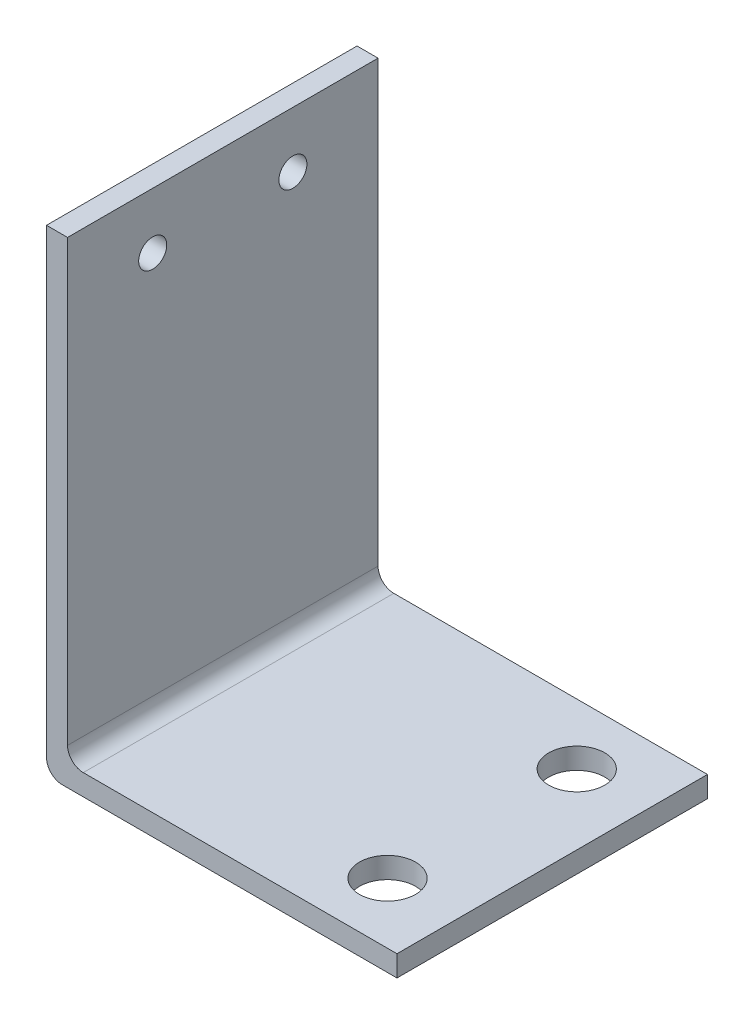
ISO-10303-21;
HEADER;
FILE_DESCRIPTION(('STEP AP214'),'2;1');
FILE_NAME('part.step','',(''),(''),'','','');
FILE_SCHEMA(('AUTOMOTIVE_DESIGN { 1 0 10303 214 1 1 1 1 }'));
ENDSEC;
DATA;
#1=APPLICATION_CONTEXT('core data for automotive mechanical design processes');
#2=APPLICATION_PROTOCOL_DEFINITION('international standard','automotive_design',2000,#1);
#3=PRODUCT_CONTEXT('',#1,'mechanical');
#4=PRODUCT('Part','Part','',(#3));
#5=PRODUCT_RELATED_PRODUCT_CATEGORY('part','',(#4));
#6=PRODUCT_DEFINITION_FORMATION('','',#4);
#7=PRODUCT_DEFINITION_CONTEXT('part definition',#1,'design');
#8=PRODUCT_DEFINITION('design','',#6,#7);
#9=PRODUCT_DEFINITION_SHAPE('','',#8);
#10=(LENGTH_UNIT() NAMED_UNIT(*) SI_UNIT(.MILLI.,.METRE.));
#11=(NAMED_UNIT(*) PLANE_ANGLE_UNIT() SI_UNIT($,.RADIAN.));
#12=(NAMED_UNIT(*) SI_UNIT($,.STERADIAN.) SOLID_ANGLE_UNIT());
#13=UNCERTAINTY_MEASURE_WITH_UNIT(LENGTH_MEASURE(1.E-05),#10,'distance_accuracy_value','');
#14=(GEOMETRIC_REPRESENTATION_CONTEXT(3) GLOBAL_UNCERTAINTY_ASSIGNED_CONTEXT((#13)) GLOBAL_UNIT_ASSIGNED_CONTEXT((#10,
#11,#12)) REPRESENTATION_CONTEXT('',''));
#15=CARTESIAN_POINT('',(0.,0.,0.));
#16=DIRECTION('',(0.,0.,1.));
#17=DIRECTION('',(1.,0.,0.));
#18=AXIS2_PLACEMENT_3D('',#15,#16,#17);
#19=CARTESIAN_POINT('',(0.,34.,22.15));
#20=DIRECTION('',(0.,-1.,0.));
#21=DIRECTION('',(0.,0.,-1.));
#22=AXIS2_PLACEMENT_3D('',#19,#20,#21);
#23=PLANE('',#22);
#24=DIRECTION('',(-1.,0.,0.));
#25=VECTOR('',#24,1.);
#26=CARTESIAN_POINT('',(0.,34.,0.));
#27=LINE('',#26,#25);
#28=CARTESIAN_POINT('',(1.5,34.,0.));
#29=VERTEX_POINT('',#28);
#30=CARTESIAN_POINT('',(0.,34.,0.));
#31=VERTEX_POINT('',#30);
#32=EDGE_CURVE('E128',#29,#31,#27,.T.);
#33=ORIENTED_EDGE('',*,*,#32,.T.);
#34=DIRECTION('',(0.,0.,-1.));
#35=VECTOR('',#34,1.);
#36=CARTESIAN_POINT('',(0.,34.,22.15));
#37=LINE('',#36,#35);
#38=CARTESIAN_POINT('',(0.,34.,22.15));
#39=VERTEX_POINT('',#38);
#40=EDGE_CURVE('E11',#39,#31,#37,.T.);
#41=ORIENTED_EDGE('',*,*,#40,.F.);
#42=DIRECTION('',(-1.,0.,0.));
#43=VECTOR('',#42,1.);
#44=CARTESIAN_POINT('',(0.,34.,22.15));
#45=LINE('',#44,#43);
#46=CARTESIAN_POINT('',(1.5,34.,22.15));
#47=VERTEX_POINT('',#46);
#48=EDGE_CURVE('E143',#47,#39,#45,.T.);
#49=ORIENTED_EDGE('',*,*,#48,.F.);
#50=DIRECTION('',(0.,0.,-1.));
#51=VECTOR('',#50,1.);
#52=CARTESIAN_POINT('',(1.5,34.,22.15));
#53=LINE('',#52,#51);
#54=EDGE_CURVE('E124',#47,#29,#53,.T.);
#55=ORIENTED_EDGE('',*,*,#54,.T.);
#56=EDGE_LOOP('',(#33,#41,#49,#55));
#57=FACE_BOUND('',#56,.T.);
#58=ADVANCED_FACE('F32',(#57),#23,.F.);
#59=CARTESIAN_POINT('',(0.,1.12229101930364,22.15));
#60=DIRECTION('',(1.,0.,0.));
#61=DIRECTION('',(0.,0.,-1.));
#62=AXIS2_PLACEMENT_3D('',#59,#60,#61);
#63=PLANE('',#62);
#64=CARTESIAN_POINT('',(0.,30.,6.075));
#65=DIRECTION('',(1.,0.,0.));
#66=DIRECTION('',(0.,0.,-1.));
#67=AXIS2_PLACEMENT_3D('',#64,#65,#66);
#68=CIRCLE('',#67,1.);
#69=CARTESIAN_POINT('',(0.,30.,5.075));
#70=VERTEX_POINT('',#69);
#71=EDGE_CURVE('E191',#70,#70,#68,.T.);
#72=ORIENTED_EDGE('',*,*,#71,.T.);
#73=EDGE_LOOP('',(#72));
#74=FACE_BOUND('',#73,.T.);
#75=CARTESIAN_POINT('',(0.,30.,16.075));
#76=DIRECTION('',(1.,0.,0.));
#77=DIRECTION('',(0.,0.,-1.));
#78=AXIS2_PLACEMENT_3D('',#75,#76,#77);
#79=CIRCLE('',#78,1.);
#80=CARTESIAN_POINT('',(0.,30.,15.075));
#81=VERTEX_POINT('',#80);
#82=EDGE_CURVE('E185',#81,#81,#79,.T.);
#83=ORIENTED_EDGE('',*,*,#82,.T.);
#84=EDGE_LOOP('',(#83));
#85=FACE_BOUND('',#84,.T.);
#86=DIRECTION('',(0.,-1.,0.));
#87=VECTOR('',#86,1.);
#88=CARTESIAN_POINT('',(0.,1.12229101930364,0.));
#89=LINE('',#88,#87);
#90=CARTESIAN_POINT('',(0.,1.12229101930364,0.));
#91=VERTEX_POINT('',#90);
#92=EDGE_CURVE('E131',#31,#91,#89,.T.);
#93=ORIENTED_EDGE('',*,*,#92,.T.);
#94=DIRECTION('',(0.,0.,-1.));
#95=VECTOR('',#94,1.);
#96=CARTESIAN_POINT('',(0.,1.12229101930364,22.15));
#97=LINE('',#96,#95);
#98=CARTESIAN_POINT('',(0.,1.12229101930364,22.15));
#99=VERTEX_POINT('',#98);
#100=EDGE_CURVE('E40',#99,#91,#97,.T.);
#101=ORIENTED_EDGE('',*,*,#100,.F.);
#102=DIRECTION('',(0.,-1.,0.));
#103=VECTOR('',#102,1.);
#104=CARTESIAN_POINT('',(0.,1.12229101930364,22.15));
#105=LINE('',#104,#103);
#106=EDGE_CURVE('E91',#39,#99,#105,.T.);
#107=ORIENTED_EDGE('',*,*,#106,.F.);
#108=ORIENTED_EDGE('',*,*,#40,.T.);
#109=EDGE_LOOP('',(#93,#101,#107,#108));
#110=FACE_BOUND('',#109,.T.);
#111=ADVANCED_FACE('F200',(#74,#85,#110),#63,.F.);
#112=CARTESIAN_POINT('',(1.12229101930363,1.12229101930363,22.15));
#113=DIRECTION('',(0.,0.,-1.));
#114=DIRECTION('',(-1.,0.,0.));
#115=AXIS2_PLACEMENT_3D('',#112,#113,#114);
#116=CYLINDRICAL_SURFACE('',#115,1.12229101930363);
#117=CARTESIAN_POINT('',(1.12229101930363,1.12229101930363,0.));
#118=DIRECTION('',(0.,0.,1.));
#119=DIRECTION('',(1.,0.,0.));
#120=AXIS2_PLACEMENT_3D('',#117,#118,#119);
#121=CIRCLE('',#120,1.12229101930363);
#122=CARTESIAN_POINT('',(1.12229101930364,0.,0.));
#123=VERTEX_POINT('',#122);
#124=EDGE_CURVE('E134',#91,#123,#121,.T.);
#125=ORIENTED_EDGE('',*,*,#124,.T.);
#126=DIRECTION('',(0.,0.,-1.));
#127=VECTOR('',#126,1.);
#128=CARTESIAN_POINT('',(1.12229101930364,0.,22.15));
#129=LINE('',#128,#127);
#130=CARTESIAN_POINT('',(1.12229101930364,0.,22.15));
#131=VERTEX_POINT('',#130);
#132=EDGE_CURVE('E150',#131,#123,#129,.T.);
#133=ORIENTED_EDGE('',*,*,#132,.F.);
#134=CARTESIAN_POINT('',(1.12229101930363,1.12229101930363,22.15));
#135=DIRECTION('',(0.,0.,1.));
#136=DIRECTION('',(1.,0.,0.));
#137=AXIS2_PLACEMENT_3D('',#134,#135,#136);
#138=CIRCLE('',#137,1.12229101930363);
#139=EDGE_CURVE('E158',#99,#131,#138,.T.);
#140=ORIENTED_EDGE('',*,*,#139,.F.);
#141=ORIENTED_EDGE('',*,*,#100,.T.);
#142=EDGE_LOOP('',(#125,#133,#140,#141));
#143=FACE_BOUND('',#142,.T.);
#144=ADVANCED_FACE('F156',(#143),#116,.T.);
#145=CARTESIAN_POINT('',(1.12229101930364,0.,22.15));
#146=DIRECTION('',(0.,1.,0.));
#147=DIRECTION('',(0.,0.,1.));
#148=AXIS2_PLACEMENT_3D('',#145,#146,#147);
#149=PLANE('',#148);
#150=CARTESIAN_POINT('',(20.,0.,17.825));
#151=DIRECTION('',(0.,1.,0.));
#152=DIRECTION('',(0.,0.,1.));
#153=AXIS2_PLACEMENT_3D('',#150,#151,#152);
#154=CIRCLE('',#153,2.00000000000001);
#155=CARTESIAN_POINT('',(20.,0.,19.825));
#156=VERTEX_POINT('',#155);
#157=EDGE_CURVE('E179',#156,#156,#154,.T.);
#158=ORIENTED_EDGE('',*,*,#157,.T.);
#159=EDGE_LOOP('',(#158));
#160=FACE_BOUND('',#159,.T.);
#161=CARTESIAN_POINT('',(20.,0.,4.325));
#162=DIRECTION('',(0.,1.,0.));
#163=DIRECTION('',(0.,0.,1.));
#164=AXIS2_PLACEMENT_3D('',#161,#162,#163);
#165=CIRCLE('',#164,2.);
#166=CARTESIAN_POINT('',(20.,0.,6.325));
#167=VERTEX_POINT('',#166);
#168=EDGE_CURVE('E132',#167,#167,#165,.T.);
#169=ORIENTED_EDGE('',*,*,#168,.T.);
#170=EDGE_LOOP('',(#169));
#171=FACE_BOUND('',#170,.T.);
#172=DIRECTION('',(1.,0.,0.));
#173=VECTOR('',#172,1.);
#174=CARTESIAN_POINT('',(1.12229101930364,0.,0.));
#175=LINE('',#174,#173);
#176=CARTESIAN_POINT('',(25.,0.,0.));
#177=VERTEX_POINT('',#176);
#178=EDGE_CURVE('E136',#123,#177,#175,.T.);
#179=ORIENTED_EDGE('',*,*,#178,.T.);
#180=DIRECTION('',(0.,0.,-1.));
#181=VECTOR('',#180,1.);
#182=CARTESIAN_POINT('',(25.,0.,22.15));
#183=LINE('',#182,#181);
#184=CARTESIAN_POINT('',(25.,0.,22.15));
#185=VERTEX_POINT('',#184);
#186=EDGE_CURVE('E147',#185,#177,#183,.T.);
#187=ORIENTED_EDGE('',*,*,#186,.F.);
#188=DIRECTION('',(1.,0.,0.));
#189=VECTOR('',#188,1.);
#190=CARTESIAN_POINT('',(1.12229101930364,0.,22.15));
#191=LINE('',#190,#189);
#192=EDGE_CURVE('E170',#131,#185,#191,.T.);
#193=ORIENTED_EDGE('',*,*,#192,.F.);
#194=ORIENTED_EDGE('',*,*,#132,.T.);
#195=EDGE_LOOP('',(#179,#187,#193,#194));
#196=FACE_BOUND('',#195,.T.);
#197=ADVANCED_FACE('F166',(#160,#171,#196),#149,.F.);
#198=CARTESIAN_POINT('',(25.,0.,22.15));
#199=DIRECTION('',(-1.,0.,0.));
#200=DIRECTION('',(0.,0.,1.));
#201=AXIS2_PLACEMENT_3D('',#198,#199,#200);
#202=PLANE('',#201);
#203=DIRECTION('',(0.,1.,0.));
#204=VECTOR('',#203,1.);
#205=CARTESIAN_POINT('',(25.,0.,0.));
#206=LINE('',#205,#204);
#207=CARTESIAN_POINT('',(25.,1.5,0.));
#208=VERTEX_POINT('',#207);
#209=EDGE_CURVE('E138',#177,#208,#206,.T.);
#210=ORIENTED_EDGE('',*,*,#209,.T.);
#211=DIRECTION('',(0.,0.,-1.));
#212=VECTOR('',#211,1.);
#213=CARTESIAN_POINT('',(25.,1.5,22.15));
#214=LINE('',#213,#212);
#215=CARTESIAN_POINT('',(25.,1.5,22.15));
#216=VERTEX_POINT('',#215);
#217=EDGE_CURVE('E119',#216,#208,#214,.T.);
#218=ORIENTED_EDGE('',*,*,#217,.F.);
#219=DIRECTION('',(0.,1.,0.));
#220=VECTOR('',#219,1.);
#221=CARTESIAN_POINT('',(25.,0.,22.15));
#222=LINE('',#221,#220);
#223=EDGE_CURVE('E110',#185,#216,#222,.T.);
#224=ORIENTED_EDGE('',*,*,#223,.F.);
#225=ORIENTED_EDGE('',*,*,#186,.T.);
#226=EDGE_LOOP('',(#210,#218,#224,#225));
#227=FACE_BOUND('',#226,.T.);
#228=ADVANCED_FACE('F169',(#227),#202,.F.);
#229=CARTESIAN_POINT('',(2.62229101930364,1.5,22.15));
#230=DIRECTION('',(0.,-1.,0.));
#231=DIRECTION('',(0.,0.,-1.));
#232=AXIS2_PLACEMENT_3D('',#229,#230,#231);
#233=PLANE('',#232);
#234=CARTESIAN_POINT('',(20.,1.5,17.825));
#235=DIRECTION('',(0.,1.,0.));
#236=DIRECTION('',(0.,0.,1.));
#237=AXIS2_PLACEMENT_3D('',#234,#235,#236);
#238=CIRCLE('',#237,2.00000000000001);
#239=CARTESIAN_POINT('',(20.,1.5,19.825));
#240=VERTEX_POINT('',#239);
#241=EDGE_CURVE('E182',#240,#240,#238,.T.);
#242=ORIENTED_EDGE('',*,*,#241,.F.);
#243=EDGE_LOOP('',(#242));
#244=FACE_BOUND('',#243,.T.);
#245=CARTESIAN_POINT('',(20.,1.5,4.325));
#246=DIRECTION('',(0.,1.,0.));
#247=DIRECTION('',(0.,0.,1.));
#248=AXIS2_PLACEMENT_3D('',#245,#246,#247);
#249=CIRCLE('',#248,2.);
#250=CARTESIAN_POINT('',(20.,1.5,6.325));
#251=VERTEX_POINT('',#250);
#252=EDGE_CURVE('E176',#251,#251,#249,.T.);
#253=ORIENTED_EDGE('',*,*,#252,.F.);
#254=EDGE_LOOP('',(#253));
#255=FACE_BOUND('',#254,.T.);
#256=DIRECTION('',(-1.,0.,0.));
#257=VECTOR('',#256,1.);
#258=CARTESIAN_POINT('',(2.62229101930364,1.5,0.));
#259=LINE('',#258,#257);
#260=CARTESIAN_POINT('',(2.62229101930364,1.5,0.));
#261=VERTEX_POINT('',#260);
#262=EDGE_CURVE('E118',#208,#261,#259,.T.);
#263=ORIENTED_EDGE('',*,*,#262,.T.);
#264=DIRECTION('',(0.,0.,-1.));
#265=VECTOR('',#264,1.);
#266=CARTESIAN_POINT('',(2.62229101930364,1.5,22.15));
#267=LINE('',#266,#265);
#268=CARTESIAN_POINT('',(2.62229101930364,1.5,22.15));
#269=VERTEX_POINT('',#268);
#270=EDGE_CURVE('E115',#269,#261,#267,.T.);
#271=ORIENTED_EDGE('',*,*,#270,.F.);
#272=DIRECTION('',(-1.,0.,0.));
#273=VECTOR('',#272,1.);
#274=CARTESIAN_POINT('',(2.62229101930364,1.5,22.15));
#275=LINE('',#274,#273);
#276=EDGE_CURVE('E104',#216,#269,#275,.T.);
#277=ORIENTED_EDGE('',*,*,#276,.F.);
#278=ORIENTED_EDGE('',*,*,#217,.T.);
#279=EDGE_LOOP('',(#263,#271,#277,#278));
#280=FACE_BOUND('',#279,.T.);
#281=ADVANCED_FACE('F116',(#244,#255,#280),#233,.F.);
#282=CARTESIAN_POINT('',(2.62229101930363,2.62229101930363,22.15));
#283=DIRECTION('',(0.,0.,-1.));
#284=DIRECTION('',(-1.,0.,0.));
#285=AXIS2_PLACEMENT_3D('',#282,#283,#284);
#286=CYLINDRICAL_SURFACE('',#285,1.12229101930363);
#287=CARTESIAN_POINT('',(2.62229101930363,2.62229101930363,0.));
#288=DIRECTION('',(0.,0.,-1.));
#289=DIRECTION('',(-1.,0.,0.));
#290=AXIS2_PLACEMENT_3D('',#287,#288,#289);
#291=CIRCLE('',#290,1.12229101930363);
#292=CARTESIAN_POINT('',(1.5,2.62229101930364,0.));
#293=VERTEX_POINT('',#292);
#294=EDGE_CURVE('E77',#261,#293,#291,.T.);
#295=ORIENTED_EDGE('',*,*,#294,.T.);
#296=DIRECTION('',(0.,0.,-1.));
#297=VECTOR('',#296,1.);
#298=CARTESIAN_POINT('',(1.5,2.62229101930364,22.15));
#299=LINE('',#298,#297);
#300=CARTESIAN_POINT('',(1.5,2.62229101930364,22.15));
#301=VERTEX_POINT('',#300);
#302=EDGE_CURVE('E120',#301,#293,#299,.T.);
#303=ORIENTED_EDGE('',*,*,#302,.F.);
#304=CARTESIAN_POINT('',(2.62229101930363,2.62229101930363,22.15));
#305=DIRECTION('',(0.,0.,-1.));
#306=DIRECTION('',(-1.,0.,0.));
#307=AXIS2_PLACEMENT_3D('',#304,#305,#306);
#308=CIRCLE('',#307,1.12229101930363);
#309=EDGE_CURVE('E108',#269,#301,#308,.T.);
#310=ORIENTED_EDGE('',*,*,#309,.F.);
#311=ORIENTED_EDGE('',*,*,#270,.T.);
#312=EDGE_LOOP('',(#295,#303,#310,#311));
#313=FACE_BOUND('',#312,.T.);
#314=ADVANCED_FACE('F122',(#313),#286,.F.);
#315=CARTESIAN_POINT('',(1.5,2.62229101930364,22.15));
#316=DIRECTION('',(-1.,0.,0.));
#317=DIRECTION('',(0.,0.,1.));
#318=AXIS2_PLACEMENT_3D('',#315,#316,#317);
#319=PLANE('',#318);
#320=CARTESIAN_POINT('',(1.5,30.,6.075));
#321=DIRECTION('',(1.,0.,0.));
#322=DIRECTION('',(0.,0.,-1.));
#323=AXIS2_PLACEMENT_3D('',#320,#321,#322);
#324=CIRCLE('',#323,1.);
#325=CARTESIAN_POINT('',(1.5,30.,5.075));
#326=VERTEX_POINT('',#325);
#327=EDGE_CURVE('E194',#326,#326,#324,.T.);
#328=ORIENTED_EDGE('',*,*,#327,.F.);
#329=EDGE_LOOP('',(#328));
#330=FACE_BOUND('',#329,.T.);
#331=CARTESIAN_POINT('',(1.5,30.,16.075));
#332=DIRECTION('',(1.,0.,0.));
#333=DIRECTION('',(0.,0.,-1.));
#334=AXIS2_PLACEMENT_3D('',#331,#332,#333);
#335=CIRCLE('',#334,1.);
#336=CARTESIAN_POINT('',(1.5,30.,15.075));
#337=VERTEX_POINT('',#336);
#338=EDGE_CURVE('E188',#337,#337,#335,.T.);
#339=ORIENTED_EDGE('',*,*,#338,.F.);
#340=EDGE_LOOP('',(#339));
#341=FACE_BOUND('',#340,.T.);
#342=DIRECTION('',(0.,1.,0.));
#343=VECTOR('',#342,1.);
#344=CARTESIAN_POINT('',(1.5,2.62229101930364,0.));
#345=LINE('',#344,#343);
#346=EDGE_CURVE('E83',#293,#29,#345,.T.);
#347=ORIENTED_EDGE('',*,*,#346,.T.);
#348=ORIENTED_EDGE('',*,*,#54,.F.);
#349=DIRECTION('',(0.,1.,0.));
#350=VECTOR('',#349,1.);
#351=CARTESIAN_POINT('',(1.5,2.62229101930364,22.15));
#352=LINE('',#351,#350);
#353=EDGE_CURVE('E48',#301,#47,#352,.T.);
#354=ORIENTED_EDGE('',*,*,#353,.F.);
#355=ORIENTED_EDGE('',*,*,#302,.T.);
#356=EDGE_LOOP('',(#347,#348,#354,#355));
#357=FACE_BOUND('',#356,.T.);
#358=ADVANCED_FACE('F210',(#330,#341,#357),#319,.F.);
#359=CARTESIAN_POINT('',(2.62229101930363,2.62229101930363,22.15));
#360=DIRECTION('',(0.,0.,-1.));
#361=DIRECTION('',(-1.,0.,0.));
#362=AXIS2_PLACEMENT_3D('',#359,#360,#361);
#363=PLANE('',#362);
#364=ORIENTED_EDGE('',*,*,#48,.T.);
#365=ORIENTED_EDGE('',*,*,#106,.T.);
#366=ORIENTED_EDGE('',*,*,#139,.T.);
#367=ORIENTED_EDGE('',*,*,#192,.T.);
#368=ORIENTED_EDGE('',*,*,#223,.T.);
#369=ORIENTED_EDGE('',*,*,#276,.T.);
#370=ORIENTED_EDGE('',*,*,#309,.T.);
#371=ORIENTED_EDGE('',*,*,#353,.T.);
#372=EDGE_LOOP('',(#364,#365,#366,#367,#368,#369,#370,#371));
#373=FACE_BOUND('',#372,.T.);
#374=ADVANCED_FACE('F106',(#373),#363,.F.);
#375=CARTESIAN_POINT('',(2.62229101930363,2.62229101930363,0.));
#376=DIRECTION('',(0.,0.,-1.));
#377=DIRECTION('',(-1.,0.,0.));
#378=AXIS2_PLACEMENT_3D('',#375,#376,#377);
#379=PLANE('',#378);
#380=ORIENTED_EDGE('',*,*,#32,.F.);
#381=ORIENTED_EDGE('',*,*,#346,.F.);
#382=ORIENTED_EDGE('',*,*,#294,.F.);
#383=ORIENTED_EDGE('',*,*,#262,.F.);
#384=ORIENTED_EDGE('',*,*,#209,.F.);
#385=ORIENTED_EDGE('',*,*,#178,.F.);
#386=ORIENTED_EDGE('',*,*,#124,.F.);
#387=ORIENTED_EDGE('',*,*,#92,.F.);
#388=EDGE_LOOP('',(#380,#381,#382,#383,#384,#385,#386,#387));
#389=FACE_BOUND('',#388,.T.);
#390=ADVANCED_FACE('F162',(#389),#379,.T.);
#391=CARTESIAN_POINT('',(20.,0.,4.325));
#392=DIRECTION('',(0.,1.,0.));
#393=DIRECTION('',(0.,0.,1.));
#394=AXIS2_PLACEMENT_3D('',#391,#392,#393);
#395=CYLINDRICAL_SURFACE('',#394,2.);
#396=ORIENTED_EDGE('',*,*,#168,.F.);
#397=EDGE_LOOP('',(#396));
#398=FACE_BOUND('',#397,.T.);
#399=ORIENTED_EDGE('',*,*,#252,.T.);
#400=EDGE_LOOP('',(#399));
#401=FACE_BOUND('',#400,.T.);
#402=ADVANCED_FACE('F223',(#398,#401),#395,.F.);
#403=CARTESIAN_POINT('',(20.,0.,17.825));
#404=DIRECTION('',(0.,1.,0.));
#405=DIRECTION('',(0.,0.,1.));
#406=AXIS2_PLACEMENT_3D('',#403,#404,#405);
#407=CYLINDRICAL_SURFACE('',#406,2.00000000000001);
#408=ORIENTED_EDGE('',*,*,#157,.F.);
#409=EDGE_LOOP('',(#408));
#410=FACE_BOUND('',#409,.T.);
#411=ORIENTED_EDGE('',*,*,#241,.T.);
#412=EDGE_LOOP('',(#411));
#413=FACE_BOUND('',#412,.T.);
#414=ADVANCED_FACE('F217',(#410,#413),#407,.F.);
#415=CARTESIAN_POINT('',(0.,30.,16.075));
#416=DIRECTION('',(1.,0.,0.));
#417=DIRECTION('',(0.,0.,-1.));
#418=AXIS2_PLACEMENT_3D('',#415,#416,#417);
#419=CYLINDRICAL_SURFACE('',#418,1.);
#420=ORIENTED_EDGE('',*,*,#82,.F.);
#421=EDGE_LOOP('',(#420));
#422=FACE_BOUND('',#421,.T.);
#423=ORIENTED_EDGE('',*,*,#338,.T.);
#424=EDGE_LOOP('',(#423));
#425=FACE_BOUND('',#424,.T.);
#426=ADVANCED_FACE('F206',(#422,#425),#419,.F.);
#427=CARTESIAN_POINT('',(0.,30.,6.075));
#428=DIRECTION('',(1.,0.,0.));
#429=DIRECTION('',(0.,0.,-1.));
#430=AXIS2_PLACEMENT_3D('',#427,#428,#429);
#431=CYLINDRICAL_SURFACE('',#430,1.);
#432=ORIENTED_EDGE('',*,*,#71,.F.);
#433=EDGE_LOOP('',(#432));
#434=FACE_BOUND('',#433,.T.);
#435=ORIENTED_EDGE('',*,*,#327,.T.);
#436=EDGE_LOOP('',(#435));
#437=FACE_BOUND('',#436,.T.);
#438=ADVANCED_FACE('F203',(#434,#437),#431,.F.);
#439=CLOSED_SHELL('',(#58,#111,#144,#197,#228,#281,#314,#358,#374,#390,#402,#414,#426,#438));
#440=MANIFOLD_SOLID_BREP('B2',#439);
#441=ADVANCED_BREP_SHAPE_REPRESENTATION('',(#18,#440),#14);
#442=SHAPE_DEFINITION_REPRESENTATION(#9,#441);
ENDSEC;
END-ISO-10303-21;
